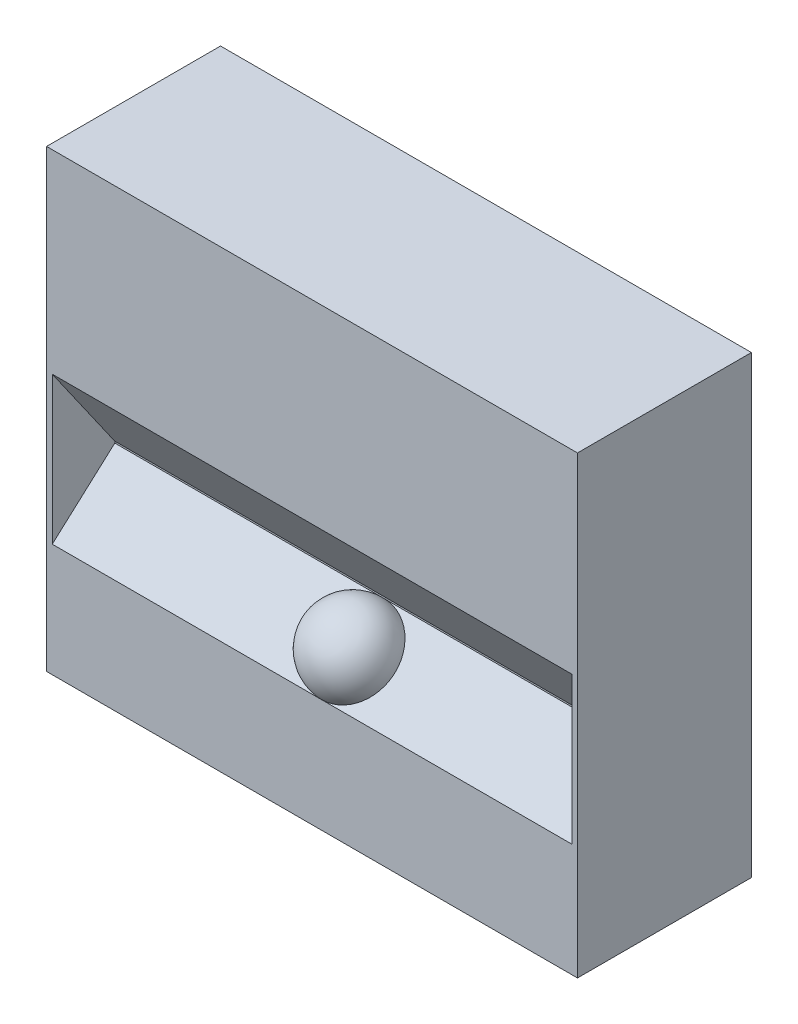
ISO-10303-21;
HEADER;
FILE_DESCRIPTION(('STEP AP214'),'2;1');
FILE_NAME('part.step','',(''),(''),'','','');
FILE_SCHEMA(('AUTOMOTIVE_DESIGN { 1 0 10303 214 1 1 1 1 }'));
ENDSEC;
DATA;
#1=APPLICATION_CONTEXT('core data for automotive mechanical design processes');
#2=APPLICATION_PROTOCOL_DEFINITION('international standard','automotive_design',2000,#1);
#3=PRODUCT_CONTEXT('',#1,'mechanical');
#4=PRODUCT('Part','Part','',(#3));
#5=PRODUCT_RELATED_PRODUCT_CATEGORY('part','',(#4));
#6=PRODUCT_DEFINITION_FORMATION('','',#4);
#7=PRODUCT_DEFINITION_CONTEXT('part definition',#1,'design');
#8=PRODUCT_DEFINITION('design','',#6,#7);
#9=PRODUCT_DEFINITION_SHAPE('','',#8);
#10=(LENGTH_UNIT() NAMED_UNIT(*) SI_UNIT(.MILLI.,.METRE.));
#11=(NAMED_UNIT(*) PLANE_ANGLE_UNIT() SI_UNIT($,.RADIAN.));
#12=(NAMED_UNIT(*) SI_UNIT($,.STERADIAN.) SOLID_ANGLE_UNIT());
#13=UNCERTAINTY_MEASURE_WITH_UNIT(LENGTH_MEASURE(1.E-05),#10,'distance_accuracy_value','');
#14=(GEOMETRIC_REPRESENTATION_CONTEXT(3) GLOBAL_UNCERTAINTY_ASSIGNED_CONTEXT((#13)) GLOBAL_UNIT_ASSIGNED_CONTEXT((#10,
#11,#12)) REPRESENTATION_CONTEXT('',''));
#15=CARTESIAN_POINT('',(0.,0.,0.));
#16=DIRECTION('',(0.,0.,1.));
#17=DIRECTION('',(1.,0.,0.));
#18=AXIS2_PLACEMENT_3D('',#15,#16,#17);
#19=CARTESIAN_POINT('',(0.,-40.2955145118729,98.));
#20=DIRECTION('',(0.,-0.743144825477397,-0.669130606358855));
#21=DIRECTION('',(1.,0.,0.));
#22=AXIS2_PLACEMENT_3D('',#19,#20,#21);
#23=PLANE('',#22);
#24=CARTESIAN_POINT('',(-24.4780471512094,-65.0566257300633,125.5));
#25=DIRECTION('',(0.,0.743144825477398,0.669130606358855));
#26=DIRECTION('',(0.,0.669130606358855,-0.743144825477398));
#27=AXIS2_PLACEMENT_3D('',#24,#25,#26);
#28=CIRCLE('',#27,37.0049000641752);
#29=CARTESIAN_POINT('',(-24.4780471512094,-40.2955145118729,98.));
#30=VERTEX_POINT('',#29);
#31=CARTESIAN_POINT('',(-24.4780471512091,-89.8177369482536,153.));
#32=VERTEX_POINT('',#31);
#33=EDGE_CURVE('E129',#30,#32,#28,.T.);
#34=ORIENTED_EDGE('',*,*,#33,.F.);
#35=DIRECTION('',(1.,0.,0.));
#36=VECTOR('',#35,1.);
#37=CARTESIAN_POINT('',(0.,-40.2955145118729,98.));
#38=LINE('',#37,#36);
#39=CARTESIAN_POINT('',(-261.153034300791,-40.2955145118729,98.));
#40=VERTEX_POINT('',#39);
#41=EDGE_CURVE('E113',#40,#30,#38,.T.);
#42=ORIENTED_EDGE('',*,*,#41,.F.);
#43=DIRECTION('',(0.,0.669130606358855,-0.743144825477397));
#44=VECTOR('',#43,1.);
#45=CARTESIAN_POINT('',(-261.153034300791,-40.2955145118729,98.));
#46=LINE('',#45,#44);
#47=CARTESIAN_POINT('',(-261.153034300791,-89.8177369482536,153.));
#48=VERTEX_POINT('',#47);
#49=EDGE_CURVE('E307',#48,#40,#46,.T.);
#50=ORIENTED_EDGE('',*,*,#49,.F.);
#51=DIRECTION('',(-1.,0.,0.));
#52=VECTOR('',#51,1.);
#53=CARTESIAN_POINT('',(0.,-89.8177369482536,153.));
#54=LINE('',#53,#52);
#55=EDGE_CURVE('E62',#32,#48,#54,.T.);
#56=ORIENTED_EDGE('',*,*,#55,.F.);
#57=EDGE_LOOP('',(#34,#42,#50,#56));
#58=FACE_BOUND('',#57,.T.);
#59=ADVANCED_FACE('F41',(#58),#23,.F.);
#60=CARTESIAN_POINT('',(-24.4780471512094,-65.0566257300633,125.5));
#61=DIRECTION('',(0.,-0.743144825477397,-0.669130606358855));
#62=DIRECTION('',(0.,0.669130606358855,-0.743144825477397));
#63=AXIS2_PLACEMENT_3D('',#60,#61,#62);
#64=CIRCLE('',#63,37.0049000641752);
#65=EDGE_CURVE('E11',#32,#30,#64,.F.);
#66=ORIENTED_EDGE('',*,*,#65,.F.);
#67=CARTESIAN_POINT('',(195.846965699209,-89.8177369482536,153.));
#68=VERTEX_POINT('',#67);
#69=EDGE_CURVE('E49',#68,#32,#54,.T.);
#70=ORIENTED_EDGE('',*,*,#69,.F.);
#71=DIRECTION('',(0.,-0.669130606358855,0.743144825477397));
#72=VECTOR('',#71,1.);
#73=CARTESIAN_POINT('',(195.846965699209,-40.2955145118729,98.));
#74=LINE('',#73,#72);
#75=CARTESIAN_POINT('',(195.846965699209,-40.2955145118729,98.));
#76=VERTEX_POINT('',#75);
#77=EDGE_CURVE('E123',#76,#68,#74,.T.);
#78=ORIENTED_EDGE('',*,*,#77,.F.);
#79=EDGE_CURVE('E115',#30,#76,#38,.T.);
#80=ORIENTED_EDGE('',*,*,#79,.F.);
#81=EDGE_LOOP('',(#66,#70,#78,#80));
#82=FACE_BOUND('',#81,.T.);
#83=ADVANCED_FACE('F125',(#82),#23,.F.);
#84=CARTESIAN_POINT('',(-266.153034300792,210.704485488127,153.));
#85=DIRECTION('',(1.,0.,0.));
#86=DIRECTION('',(0.,0.,-1.));
#87=AXIS2_PLACEMENT_3D('',#84,#85,#86);
#88=PLANE('',#87);
#89=DIRECTION('',(0.,-1.,0.));
#90=VECTOR('',#89,1.);
#91=CARTESIAN_POINT('',(-266.153034300792,210.704485488127,0.));
#92=LINE('',#91,#90);
#93=CARTESIAN_POINT('',(-266.153034300792,210.704485488127,0.));
#94=VERTEX_POINT('',#93);
#95=CARTESIAN_POINT('',(-266.153034300792,-189.295514511873,0.));
#96=VERTEX_POINT('',#95);
#97=EDGE_CURVE('E263',#94,#96,#92,.T.);
#98=ORIENTED_EDGE('',*,*,#97,.T.);
#99=DIRECTION('',(0.,0.,-1.));
#100=VECTOR('',#99,1.);
#101=CARTESIAN_POINT('',(-266.153034300792,-189.295514511873,153.));
#102=LINE('',#101,#100);
#103=CARTESIAN_POINT('',(-266.153034300792,-189.295514511873,153.));
#104=VERTEX_POINT('',#103);
#105=EDGE_CURVE('E298',#104,#96,#102,.T.);
#106=ORIENTED_EDGE('',*,*,#105,.F.);
#107=DIRECTION('',(0.,-1.,0.));
#108=VECTOR('',#107,1.);
#109=CARTESIAN_POINT('',(-266.153034300792,210.704485488127,153.));
#110=LINE('',#109,#108);
#111=CARTESIAN_POINT('',(-266.153034300792,210.704485488127,153.));
#112=VERTEX_POINT('',#111);
#113=EDGE_CURVE('E275',#112,#104,#110,.T.);
#114=ORIENTED_EDGE('',*,*,#113,.F.);
#115=DIRECTION('',(0.,0.,-1.));
#116=VECTOR('',#115,1.);
#117=CARTESIAN_POINT('',(-266.153034300792,210.704485488127,153.));
#118=LINE('',#117,#116);
#119=EDGE_CURVE('E284',#112,#94,#118,.T.);
#120=ORIENTED_EDGE('',*,*,#119,.T.);
#121=EDGE_LOOP('',(#98,#106,#114,#120));
#122=FACE_BOUND('',#121,.T.);
#123=ADVANCED_FACE('F148',(#122),#88,.F.);
#124=CARTESIAN_POINT('',(-266.153034300792,-189.295514511873,153.));
#125=DIRECTION('',(0.,1.,0.));
#126=DIRECTION('',(0.,0.,1.));
#127=AXIS2_PLACEMENT_3D('',#124,#125,#126);
#128=PLANE('',#127);
#129=DIRECTION('',(1.,0.,0.));
#130=VECTOR('',#129,1.);
#131=CARTESIAN_POINT('',(-266.153034300792,-189.295514511873,0.));
#132=LINE('',#131,#130);
#133=CARTESIAN_POINT('',(200.846965699209,-189.295514511873,0.));
#134=VERTEX_POINT('',#133);
#135=EDGE_CURVE('E265',#96,#134,#132,.T.);
#136=ORIENTED_EDGE('',*,*,#135,.T.);
#137=DIRECTION('',(0.,0.,-1.));
#138=VECTOR('',#137,1.);
#139=CARTESIAN_POINT('',(200.846965699209,-189.295514511873,153.));
#140=LINE('',#139,#138);
#141=CARTESIAN_POINT('',(200.846965699209,-189.295514511873,153.));
#142=VERTEX_POINT('',#141);
#143=EDGE_CURVE('E295',#142,#134,#140,.T.);
#144=ORIENTED_EDGE('',*,*,#143,.F.);
#145=DIRECTION('',(1.,0.,0.));
#146=VECTOR('',#145,1.);
#147=CARTESIAN_POINT('',(-266.153034300792,-189.295514511873,153.));
#148=LINE('',#147,#146);
#149=EDGE_CURVE('E278',#104,#142,#148,.T.);
#150=ORIENTED_EDGE('',*,*,#149,.F.);
#151=ORIENTED_EDGE('',*,*,#105,.T.);
#152=EDGE_LOOP('',(#136,#144,#150,#151));
#153=FACE_BOUND('',#152,.T.);
#154=ADVANCED_FACE('F153',(#153),#128,.F.);
#155=CARTESIAN_POINT('',(200.846965699208,210.704485488127,153.));
#156=DIRECTION('',(-1.,0.,0.));
#157=DIRECTION('',(0.,-1.,0.));
#158=AXIS2_PLACEMENT_3D('',#155,#156,#157);
#159=PLANE('',#158);
#160=DIRECTION('',(0.,1.,0.));
#161=VECTOR('',#160,1.);
#162=CARTESIAN_POINT('',(200.846965699208,210.704485488127,0.));
#163=LINE('',#162,#161);
#164=CARTESIAN_POINT('',(200.846965699208,210.704485488127,0.));
#165=VERTEX_POINT('',#164);
#166=EDGE_CURVE('E287',#134,#165,#163,.T.);
#167=ORIENTED_EDGE('',*,*,#166,.T.);
#168=DIRECTION('',(0.,0.,-1.));
#169=VECTOR('',#168,1.);
#170=CARTESIAN_POINT('',(200.846965699208,210.704485488127,153.));
#171=LINE('',#170,#169);
#172=CARTESIAN_POINT('',(200.846965699208,210.704485488127,153.));
#173=VERTEX_POINT('',#172);
#174=EDGE_CURVE('E292',#173,#165,#171,.T.);
#175=ORIENTED_EDGE('',*,*,#174,.F.);
#176=DIRECTION('',(0.,1.,0.));
#177=VECTOR('',#176,1.);
#178=CARTESIAN_POINT('',(200.846965699208,210.704485488127,153.));
#179=LINE('',#178,#177);
#180=EDGE_CURVE('E281',#142,#173,#179,.T.);
#181=ORIENTED_EDGE('',*,*,#180,.F.);
#182=ORIENTED_EDGE('',*,*,#143,.T.);
#183=EDGE_LOOP('',(#167,#175,#181,#182));
#184=FACE_BOUND('',#183,.T.);
#185=ADVANCED_FACE('F159',(#184),#159,.F.);
#186=CARTESIAN_POINT('',(-266.153034300792,210.704485488127,153.));
#187=DIRECTION('',(0.,-1.,0.));
#188=DIRECTION('',(0.,0.,-1.));
#189=AXIS2_PLACEMENT_3D('',#186,#187,#188);
#190=PLANE('',#189);
#191=DIRECTION('',(-1.,0.,0.));
#192=VECTOR('',#191,1.);
#193=CARTESIAN_POINT('',(-266.153034300792,210.704485488127,0.));
#194=LINE('',#193,#192);
#195=EDGE_CURVE('E279',#165,#94,#194,.T.);
#196=ORIENTED_EDGE('',*,*,#195,.T.);
#197=ORIENTED_EDGE('',*,*,#119,.F.);
#198=DIRECTION('',(-1.,0.,0.));
#199=VECTOR('',#198,1.);
#200=CARTESIAN_POINT('',(-266.153034300792,210.704485488127,153.));
#201=LINE('',#200,#199);
#202=EDGE_CURVE('E283',#173,#112,#201,.T.);
#203=ORIENTED_EDGE('',*,*,#202,.F.);
#204=ORIENTED_EDGE('',*,*,#174,.T.);
#205=EDGE_LOOP('',(#196,#197,#203,#204));
#206=FACE_BOUND('',#205,.T.);
#207=ADVANCED_FACE('F171',(#206),#190,.F.);
#208=CARTESIAN_POINT('',(0.,0.,153.));
#209=DIRECTION('',(0.,0.,1.));
#210=DIRECTION('',(1.,0.,0.));
#211=AXIS2_PLACEMENT_3D('',#208,#209,#210);
#212=PLANE('',#211);
#213=DIRECTION('',(0.,-1.,0.));
#214=VECTOR('',#213,1.);
#215=CARTESIAN_POINT('',(-261.153034300791,39.7044854881268,153.));
#216=LINE('',#215,#214);
#217=CARTESIAN_POINT('',(-261.153034300791,39.7044854881268,153.));
#218=VERTEX_POINT('',#217);
#219=EDGE_CURVE('E131',#218,#48,#216,.T.);
#220=ORIENTED_EDGE('',*,*,#219,.F.);
#221=DIRECTION('',(-1.,0.,0.));
#222=VECTOR('',#221,1.);
#223=CARTESIAN_POINT('',(-261.153034300791,39.7044854881268,153.));
#224=LINE('',#223,#222);
#225=CARTESIAN_POINT('',(195.846965699209,39.7044854881268,153.));
#226=VERTEX_POINT('',#225);
#227=EDGE_CURVE('E267',#226,#218,#224,.T.);
#228=ORIENTED_EDGE('',*,*,#227,.F.);
#229=DIRECTION('',(0.,1.,0.));
#230=VECTOR('',#229,1.);
#231=CARTESIAN_POINT('',(195.846965699209,39.7044854881268,153.));
#232=LINE('',#231,#230);
#233=EDGE_CURVE('E271',#68,#226,#232,.T.);
#234=ORIENTED_EDGE('',*,*,#233,.F.);
#235=ORIENTED_EDGE('',*,*,#69,.T.);
#236=ORIENTED_EDGE('',*,*,#55,.T.);
#237=EDGE_LOOP('',(#220,#228,#234,#235,#236));
#238=FACE_BOUND('',#237,.T.);
#239=ORIENTED_EDGE('',*,*,#113,.T.);
#240=ORIENTED_EDGE('',*,*,#149,.T.);
#241=ORIENTED_EDGE('',*,*,#180,.T.);
#242=ORIENTED_EDGE('',*,*,#202,.T.);
#243=EDGE_LOOP('',(#239,#240,#241,#242));
#244=FACE_BOUND('',#243,.T.);
#245=ADVANCED_FACE('F175',(#238,#244),#212,.T.);
#246=CARTESIAN_POINT('',(0.,0.,0.));
#247=DIRECTION('',(0.,0.,1.));
#248=DIRECTION('',(1.,0.,0.));
#249=AXIS2_PLACEMENT_3D('',#246,#247,#248);
#250=PLANE('',#249);
#251=ORIENTED_EDGE('',*,*,#97,.F.);
#252=ORIENTED_EDGE('',*,*,#195,.F.);
#253=ORIENTED_EDGE('',*,*,#166,.F.);
#254=ORIENTED_EDGE('',*,*,#135,.F.);
#255=EDGE_LOOP('',(#251,#252,#253,#254));
#256=FACE_BOUND('',#255,.T.);
#257=ADVANCED_FACE('F177',(#256),#250,.F.);
#258=CARTESIAN_POINT('',(-261.153034300791,39.7044854881268,98.));
#259=DIRECTION('',(-1.,0.,0.));
#260=DIRECTION('',(0.,0.,1.));
#261=AXIS2_PLACEMENT_3D('',#258,#259,#260);
#262=PLANE('',#261);
#263=ORIENTED_EDGE('',*,*,#219,.T.);
#264=ORIENTED_EDGE('',*,*,#49,.T.);
#265=DIRECTION('',(0.,-1.,0.));
#266=VECTOR('',#265,1.);
#267=CARTESIAN_POINT('',(-261.153034300791,39.7044854881268,98.));
#268=LINE('',#267,#266);
#269=CARTESIAN_POINT('',(-261.153034300791,-38.8436548826903,98.));
#270=VERTEX_POINT('',#269);
#271=EDGE_CURVE('E119',#270,#40,#268,.T.);
#272=ORIENTED_EDGE('',*,*,#271,.F.);
#273=DIRECTION('',(0.,0.819152044288995,0.573576436351042));
#274=VECTOR('',#273,1.);
#275=CARTESIAN_POINT('',(-261.153034300791,-38.8436548826903,98.));
#276=LINE('',#275,#274);
#277=EDGE_CURVE('E303',#270,#218,#276,.T.);
#278=ORIENTED_EDGE('',*,*,#277,.T.);
#279=EDGE_LOOP('',(#263,#264,#272,#278));
#280=FACE_BOUND('',#279,.T.);
#281=ADVANCED_FACE('F180',(#280),#262,.F.);
#282=CARTESIAN_POINT('',(195.846965699209,39.7044854881268,98.));
#283=DIRECTION('',(1.,0.,0.));
#284=DIRECTION('',(0.,0.,-1.));
#285=AXIS2_PLACEMENT_3D('',#282,#283,#284);
#286=PLANE('',#285);
#287=DIRECTION('',(0.,1.,0.));
#288=VECTOR('',#287,1.);
#289=CARTESIAN_POINT('',(195.846965699209,39.7044854881268,98.));
#290=LINE('',#289,#288);
#291=CARTESIAN_POINT('',(195.846965699209,-38.8436548826903,98.));
#292=VERTEX_POINT('',#291);
#293=EDGE_CURVE('E259',#76,#292,#290,.T.);
#294=ORIENTED_EDGE('',*,*,#293,.F.);
#295=ORIENTED_EDGE('',*,*,#77,.T.);
#296=ORIENTED_EDGE('',*,*,#233,.T.);
#297=DIRECTION('',(0.,-0.819152044288995,-0.573576436351042));
#298=VECTOR('',#297,1.);
#299=CARTESIAN_POINT('',(195.846965699209,-38.8436548826903,98.));
#300=LINE('',#299,#298);
#301=EDGE_CURVE('E127',#226,#292,#300,.T.);
#302=ORIENTED_EDGE('',*,*,#301,.T.);
#303=EDGE_LOOP('',(#294,#295,#296,#302));
#304=FACE_BOUND('',#303,.T.);
#305=ADVANCED_FACE('F185',(#304),#286,.F.);
#306=CARTESIAN_POINT('',(0.,0.,98.));
#307=DIRECTION('',(0.,0.,1.));
#308=DIRECTION('',(1.,0.,0.));
#309=AXIS2_PLACEMENT_3D('',#306,#307,#308);
#310=PLANE('',#309);
#311=ORIENTED_EDGE('',*,*,#271,.T.);
#312=ORIENTED_EDGE('',*,*,#41,.T.);
#313=ORIENTED_EDGE('',*,*,#79,.T.);
#314=ORIENTED_EDGE('',*,*,#293,.T.);
#315=DIRECTION('',(-1.,0.,0.));
#316=VECTOR('',#315,1.);
#317=CARTESIAN_POINT('',(0.,-38.8436548826903,98.));
#318=LINE('',#317,#316);
#319=EDGE_CURVE('E301',#292,#270,#318,.T.);
#320=ORIENTED_EDGE('',*,*,#319,.T.);
#321=EDGE_LOOP('',(#311,#312,#313,#314,#320));
#322=FACE_BOUND('',#321,.T.);
#323=ADVANCED_FACE('F114',(#322),#310,.T.);
#324=CARTESIAN_POINT('',(0.,-38.8436548826903,98.));
#325=DIRECTION('',(0.,0.573576436351042,-0.819152044288995));
#326=DIRECTION('',(-1.,0.,0.));
#327=AXIS2_PLACEMENT_3D('',#324,#325,#326);
#328=PLANE('',#327);
#329=ORIENTED_EDGE('',*,*,#301,.F.);
#330=ORIENTED_EDGE('',*,*,#227,.T.);
#331=ORIENTED_EDGE('',*,*,#277,.F.);
#332=ORIENTED_EDGE('',*,*,#319,.F.);
#333=EDGE_LOOP('',(#329,#330,#331,#332));
#334=FACE_BOUND('',#333,.T.);
#335=ADVANCED_FACE('F135',(#334),#328,.F.);
#336=CARTESIAN_POINT('',(-24.4780471512094,-65.0566257300633,125.5));
#337=DIRECTION('',(0.,-0.669130606358855,0.743144825477397));
#338=DIRECTION('',(-0.999390827019096,0.025935380386234,0.0233523213901677));
#339=AXIS2_PLACEMENT_3D('',#336,#337,#338);
#340=SPHERICAL_SURFACE('',#339,37.0049000641752);
#341=CARTESIAN_POINT('',(-24.4780471512094,-65.0566257300633,125.5));
#342=DIRECTION('',(0.,0.743144825477398,0.669130606358855));
#343=DIRECTION('',(0.,0.669130606358855,-0.743144825477398));
#344=AXIS2_PLACEMENT_3D('',#341,#342,#343);
#345=SPHERICAL_SURFACE('',#344,37.0049000641752);
#346=ORIENTED_EDGE('',*,*,#33,.T.);
#347=ORIENTED_EDGE('',*,*,#65,.T.);
#348=EDGE_LOOP('',(#346,#347));
#349=FACE_BOUND('',#348,.T.);
#350=ADVANCED_FACE('F133',(#349),#345,.T.);
#351=CLOSED_SHELL('',(#59,#83,#123,#154,#185,#207,#245,#257,#281,#305,#323,#335,#350));
#352=MANIFOLD_SOLID_BREP('B2',#351);
#353=ADVANCED_BREP_SHAPE_REPRESENTATION('',(#18,#352),#14);
#354=SHAPE_DEFINITION_REPRESENTATION(#9,#353);
ENDSEC;
END-ISO-10303-21;
